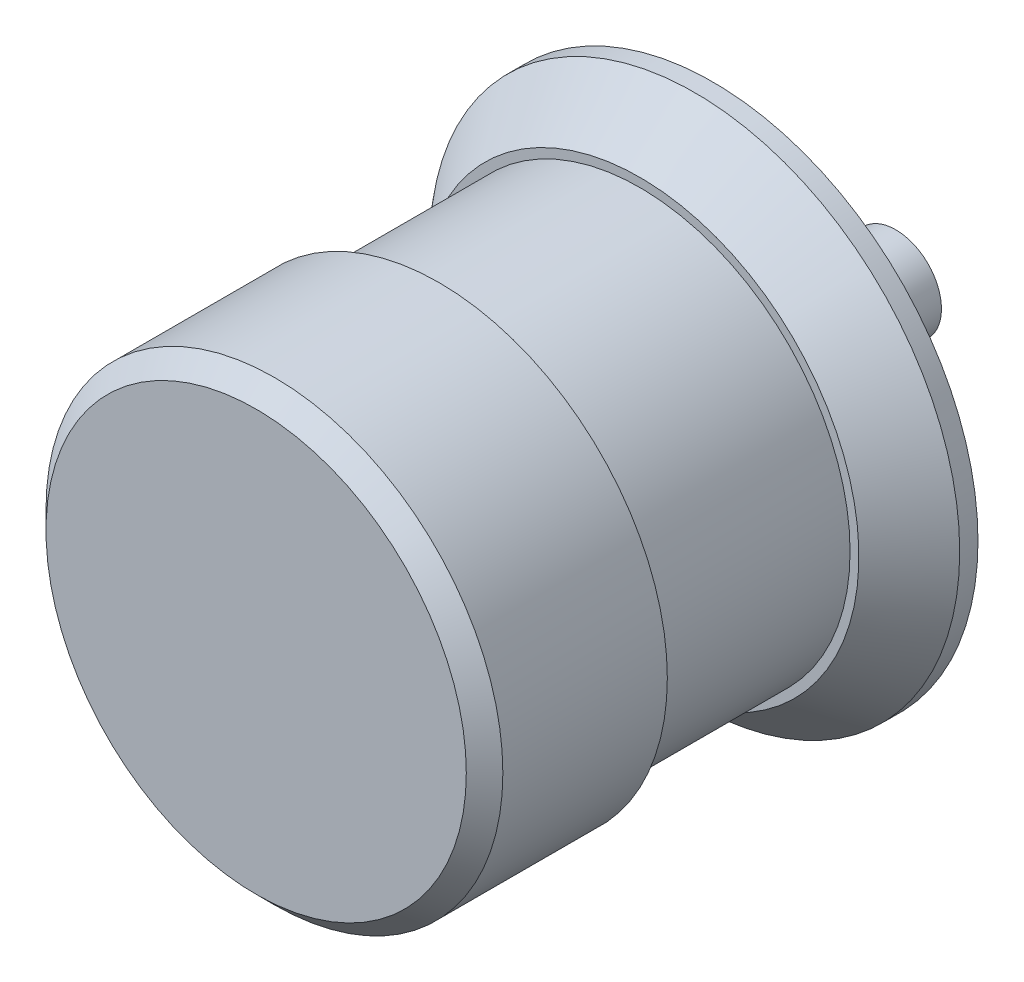
ISO-10303-21;
HEADER;
FILE_DESCRIPTION(('STEP AP214'),'2;1');
FILE_NAME('part.step','',(''),(''),'','','');
FILE_SCHEMA(('AUTOMOTIVE_DESIGN { 1 0 10303 214 1 1 1 1 }'));
ENDSEC;
DATA;
#1=APPLICATION_CONTEXT('core data for automotive mechanical design processes');
#2=APPLICATION_PROTOCOL_DEFINITION('international standard','automotive_design',2000,#1);
#3=PRODUCT_CONTEXT('',#1,'mechanical');
#4=PRODUCT('Part','Part','',(#3));
#5=PRODUCT_RELATED_PRODUCT_CATEGORY('part','',(#4));
#6=PRODUCT_DEFINITION_FORMATION('','',#4);
#7=PRODUCT_DEFINITION_CONTEXT('part definition',#1,'design');
#8=PRODUCT_DEFINITION('design','',#6,#7);
#9=PRODUCT_DEFINITION_SHAPE('','',#8);
#10=(LENGTH_UNIT() NAMED_UNIT(*) SI_UNIT(.MILLI.,.METRE.));
#11=(NAMED_UNIT(*) PLANE_ANGLE_UNIT() SI_UNIT($,.RADIAN.));
#12=(NAMED_UNIT(*) SI_UNIT($,.STERADIAN.) SOLID_ANGLE_UNIT());
#13=UNCERTAINTY_MEASURE_WITH_UNIT(LENGTH_MEASURE(1.E-05),#10,'distance_accuracy_value','');
#14=(GEOMETRIC_REPRESENTATION_CONTEXT(3) GLOBAL_UNCERTAINTY_ASSIGNED_CONTEXT((#13)) GLOBAL_UNIT_ASSIGNED_CONTEXT((#10,
#11,#12)) REPRESENTATION_CONTEXT('',''));
#15=CARTESIAN_POINT('',(0.,0.,0.));
#16=DIRECTION('',(0.,0.,1.));
#17=DIRECTION('',(1.,0.,0.));
#18=AXIS2_PLACEMENT_3D('',#15,#16,#17);
#19=CARTESIAN_POINT('',(0.,0.,30.));
#20=DIRECTION('',(0.,0.,-1.));
#21=DIRECTION('',(-1.,0.,0.));
#22=AXIS2_PLACEMENT_3D('',#19,#20,#21);
#23=CYLINDRICAL_SURFACE('',#22,29.);
#24=CARTESIAN_POINT('',(0.,0.,1.99999999999995));
#25=DIRECTION('',(0.,0.,1.));
#26=DIRECTION('',(1.,0.,0.));
#27=AXIS2_PLACEMENT_3D('',#24,#25,#26);
#28=CIRCLE('',#27,29.);
#29=CARTESIAN_POINT('',(-29.,0.,1.99999999999995));
#30=VERTEX_POINT('',#29);
#31=EDGE_CURVE('E54',#30,#30,#28,.F.);
#32=ORIENTED_EDGE('',*,*,#31,.T.);
#33=EDGE_LOOP('',(#32));
#34=FACE_BOUND('',#33,.T.);
#35=CARTESIAN_POINT('',(0.,0.,0.));
#36=DIRECTION('',(0.,0.,1.));
#37=DIRECTION('',(1.,0.,0.));
#38=AXIS2_PLACEMENT_3D('',#35,#36,#37);
#39=CIRCLE('',#38,29.);
#40=CARTESIAN_POINT('',(29.,0.,0.));
#41=VERTEX_POINT('',#40);
#42=EDGE_CURVE('E62',#41,#41,#39,.T.);
#43=ORIENTED_EDGE('',*,*,#42,.T.);
#44=EDGE_LOOP('',(#43));
#45=FACE_BOUND('',#44,.T.);
#46=ADVANCED_FACE('F39',(#34,#45),#23,.T.);
#47=CARTESIAN_POINT('',(0.,0.,0.));
#48=DIRECTION('',(0.,0.,1.));
#49=DIRECTION('',(1.,0.,0.));
#50=AXIS2_PLACEMENT_3D('',#47,#48,#49);
#51=PLANE('',#50);
#52=CARTESIAN_POINT('',(0.,0.,0.));
#53=DIRECTION('',(0.,0.,-1.));
#54=DIRECTION('',(-1.,0.,0.));
#55=AXIS2_PLACEMENT_3D('',#52,#53,#54);
#56=CIRCLE('',#55,5.);
#57=CARTESIAN_POINT('',(-5.,0.,0.));
#58=VERTEX_POINT('',#57);
#59=EDGE_CURVE('E50',#58,#58,#56,.T.);
#60=ORIENTED_EDGE('',*,*,#59,.F.);
#61=EDGE_LOOP('',(#60));
#62=FACE_BOUND('',#61,.T.);
#63=ORIENTED_EDGE('',*,*,#42,.F.);
#64=EDGE_LOOP('',(#63));
#65=FACE_BOUND('',#64,.T.);
#66=ADVANCED_FACE('F87',(#62,#65),#51,.F.);
#67=CARTESIAN_POINT('',(0.,0.,8.));
#68=DIRECTION('',(0.,0.,1.));
#69=DIRECTION('',(1.,0.,0.));
#70=AXIS2_PLACEMENT_3D('',#67,#68,#69);
#71=PLANE('',#70);
#72=CARTESIAN_POINT('',(0.,0.,8.));
#73=DIRECTION('',(0.,0.,1.));
#74=DIRECTION('',(1.,0.,0.));
#75=AXIS2_PLACEMENT_3D('',#72,#73,#74);
#76=CIRCLE('',#75,23.9654022129363);
#77=CARTESIAN_POINT('',(-23.9654022129363,0.,8.));
#78=VERTEX_POINT('',#77);
#79=EDGE_CURVE('E59',#78,#78,#76,.T.);
#80=ORIENTED_EDGE('',*,*,#79,.T.);
#81=EDGE_LOOP('',(#80));
#82=FACE_BOUND('',#81,.T.);
#83=CARTESIAN_POINT('',(0.,0.,8.));
#84=DIRECTION('',(0.,0.,1.));
#85=DIRECTION('',(1.,0.,0.));
#86=AXIS2_PLACEMENT_3D('',#83,#84,#85);
#87=CIRCLE('',#86,23.);
#88=CARTESIAN_POINT('',(23.,0.,8.));
#89=VERTEX_POINT('',#88);
#90=EDGE_CURVE('E65',#89,#89,#87,.T.);
#91=ORIENTED_EDGE('',*,*,#90,.F.);
#92=EDGE_LOOP('',(#91));
#93=FACE_BOUND('',#92,.T.);
#94=ADVANCED_FACE('F90',(#82,#93),#71,.T.);
#95=CARTESIAN_POINT('',(0.,0.,8.));
#96=DIRECTION('',(0.,0.,1.));
#97=DIRECTION('',(1.,0.,0.));
#98=AXIS2_PLACEMENT_3D('',#95,#96,#97);
#99=CYLINDRICAL_SURFACE('',#98,23.);
#100=ORIENTED_EDGE('',*,*,#90,.T.);
#101=EDGE_LOOP('',(#100));
#102=FACE_BOUND('',#101,.T.);
#103=CARTESIAN_POINT('',(0.,0.,30.));
#104=DIRECTION('',(0.,0.,1.));
#105=DIRECTION('',(1.,0.,0.));
#106=AXIS2_PLACEMENT_3D('',#103,#104,#105);
#107=CIRCLE('',#106,23.);
#108=CARTESIAN_POINT('',(23.,0.,30.));
#109=VERTEX_POINT('',#108);
#110=EDGE_CURVE('E66',#109,#109,#107,.T.);
#111=ORIENTED_EDGE('',*,*,#110,.F.);
#112=EDGE_LOOP('',(#111));
#113=FACE_BOUND('',#112,.T.);
#114=ADVANCED_FACE('F103',(#102,#113),#99,.T.);
#115=CARTESIAN_POINT('',(0.,0.,8.));
#116=DIRECTION('',(0.,0.,-1.));
#117=DIRECTION('',(-1.,0.,0.));
#118=AXIS2_PLACEMENT_3D('',#115,#116,#117);
#119=CONICAL_SURFACE('',#118,23.9654022129363,0.69813170079773);
#120=CARTESIAN_POINT('',(-29.,0.,1.99999999999995));
#121=CARTESIAN_POINT('',(-28.9475562730514,0.,2.06249999999995));
#122=CARTESIAN_POINT('',(-28.8951125461028,0.,2.12499999999995));
#123=CARTESIAN_POINT('',(-28.7902250922057,0.,2.24999999999995));
#124=CARTESIAN_POINT('',(-28.7377813652571,0.,2.31249999999995));
#125=CARTESIAN_POINT('',(-28.6328939113599,0.,2.43749999999996));
#126=CARTESIAN_POINT('',(-28.5804501844114,0.,2.49999999999996));
#127=CARTESIAN_POINT('',(-28.4755627305142,0.,2.62499999999996));
#128=CARTESIAN_POINT('',(-28.4231190035656,0.,2.68749999999996));
#129=CARTESIAN_POINT('',(-28.3182315496685,0.,2.81249999999996));
#130=CARTESIAN_POINT('',(-28.2657878227199,0.,2.87499999999996));
#131=CARTESIAN_POINT('',(-28.1609003688227,0.,2.99999999999996));
#132=CARTESIAN_POINT('',(-28.1084566418741,0.,3.06249999999996));
#133=CARTESIAN_POINT('',(-28.003569187977,0.,3.18749999999996));
#134=CARTESIAN_POINT('',(-27.9511254610284,0.,3.24999999999996));
#135=CARTESIAN_POINT('',(-27.8462380071312,0.,3.37499999999996));
#136=CARTESIAN_POINT('',(-27.7937942801827,0.,3.43749999999996));
#137=CARTESIAN_POINT('',(-27.6889068262855,0.,3.56249999999996));
#138=CARTESIAN_POINT('',(-27.6364630993369,0.,3.62499999999996));
#139=CARTESIAN_POINT('',(-27.5315756454398,0.,3.74999999999997));
#140=CARTESIAN_POINT('',(-27.4791319184912,0.,3.81249999999997));
#141=CARTESIAN_POINT('',(-27.374244464594,0.,3.93749999999997));
#142=CARTESIAN_POINT('',(-27.3218007376454,0.,3.99999999999997));
#143=CARTESIAN_POINT('',(-27.2169132837483,0.,4.12499999999997));
#144=CARTESIAN_POINT('',(-27.1644695567997,0.,4.18749999999997));
#145=CARTESIAN_POINT('',(-27.0595821029025,0.,4.31249999999997));
#146=CARTESIAN_POINT('',(-27.007138375954,0.,4.37499999999997));
#147=CARTESIAN_POINT('',(-26.9022509220568,0.,4.49999999999997));
#148=CARTESIAN_POINT('',(-26.8498071951082,0.,4.56249999999997));
#149=CARTESIAN_POINT('',(-26.7449197412111,0.,4.68749999999997));
#150=CARTESIAN_POINT('',(-26.6924760142625,0.,4.74999999999998));
#151=CARTESIAN_POINT('',(-26.5875885603653,0.,4.87499999999998));
#152=CARTESIAN_POINT('',(-26.5351448334167,0.,4.93749999999998));
#153=CARTESIAN_POINT('',(-26.4302573795196,0.,5.06249999999998));
#154=CARTESIAN_POINT('',(-26.377813652571,0.,5.12499999999998));
#155=CARTESIAN_POINT('',(-26.2729261986738,0.,5.24999999999998));
#156=CARTESIAN_POINT('',(-26.2204824717253,0.,5.31249999999998));
#157=CARTESIAN_POINT('',(-26.1155950178281,0.,5.43749999999998));
#158=CARTESIAN_POINT('',(-26.0631512908795,0.,5.49999999999998));
#159=CARTESIAN_POINT('',(-25.9582638369824,0.,5.62499999999998));
#160=CARTESIAN_POINT('',(-25.9058201100338,0.,5.68749999999998));
#161=CARTESIAN_POINT('',(-25.8009326561366,0.,5.81249999999998));
#162=CARTESIAN_POINT('',(-25.748488929188,0.,5.87499999999998));
#163=CARTESIAN_POINT('',(-25.6436014752909,0.,5.99999999999998));
#164=CARTESIAN_POINT('',(-25.5911577483423,0.,6.06249999999998));
#165=CARTESIAN_POINT('',(-25.4862702944451,0.,6.18749999999998));
#166=CARTESIAN_POINT('',(-25.4338265674965,0.,6.24999999999999));
#167=CARTESIAN_POINT('',(-25.3289391135994,0.,6.37499999999999));
#168=CARTESIAN_POINT('',(-25.2764953866508,0.,6.43749999999999));
#169=CARTESIAN_POINT('',(-25.1716079327536,0.,6.56249999999999));
#170=CARTESIAN_POINT('',(-25.1191642058051,0.,6.62499999999999));
#171=CARTESIAN_POINT('',(-25.0142767519079,0.,6.74999999999999));
#172=CARTESIAN_POINT('',(-24.9618330249593,0.,6.81249999999999));
#173=CARTESIAN_POINT('',(-24.8569455710622,0.,6.93749999999999));
#174=CARTESIAN_POINT('',(-24.8045018441136,0.,6.99999999999999));
#175=CARTESIAN_POINT('',(-24.6996143902164,0.,7.12499999999999));
#176=CARTESIAN_POINT('',(-24.6471706632678,0.,7.18749999999999));
#177=CARTESIAN_POINT('',(-24.5422832093707,0.,7.31249999999999));
#178=CARTESIAN_POINT('',(-24.4898394824221,0.,7.37499999999999));
#179=CARTESIAN_POINT('',(-24.3849520285249,0.,7.5));
#180=CARTESIAN_POINT('',(-24.3325083015764,0.,7.5625));
#181=CARTESIAN_POINT('',(-24.2276208476792,0.,7.6875));
#182=CARTESIAN_POINT('',(-24.1751771207306,0.,7.75));
#183=CARTESIAN_POINT('',(-24.0702896668335,0.,7.875));
#184=CARTESIAN_POINT('',(-24.0178459398849,0.,7.9375));
#185=CARTESIAN_POINT('',(-23.9654022129363,0.,8.));
#186=B_SPLINE_CURVE_WITH_KNOTS('',3,(#120,#121,#122,#123,#124,#125,#126,#127,#128,#129,#130,
#131,#132,#133,#134,#135,#136,#137,#138,#139,#140,#141,#142,#143,#144,#145,#146,#147,#148,#149,
#150,#151,#152,#153,#154,#155,#156,#157,#158,#159,#160,#161,#162,#163,#164,#165,#166,#167,#168,
#169,#170,#171,#172,#173,#174,#175,#176,#177,#178,#179,#180,#181,#182,#183,#184,#185),
.UNSPECIFIED.,.F.,.F.,(4,2,2,2,2,2,2,2,2,2,2,2,2,2,2,2,2,2,2,2,2,2,2,2,2,2,2,2,2,2,2,2,4),(0.,
0.244763866749805,0.489527733499608,0.734291600249413,0.979055466999217,1.22381933374902,
1.46858320049882,1.71334706724863,1.95811093399843,2.20287480074824,2.44763866749804,
2.69240253424784,2.93716640099765,3.18193026774745,3.42669413449725,3.67145800124706,
3.91622186799686,4.16098573474666,4.40574960149647,4.65051346824627,4.89527733499607,
5.14004120174588,5.38480506849568,5.62956893524549,5.87433280199529,6.11909666874509,
6.3638605354949,6.6086244022447,6.8533882689945,7.09815213574431,7.34291600249411,
7.58767986924391,7.83244373599372),.UNSPECIFIED.);
#187=EDGE_CURVE('BSEAM100',#30,#78,#186,.T.);
#188=ORIENTED_EDGE('',*,*,#31,.F.);
#189=ORIENTED_EDGE('',*,*,#79,.F.);
#190=ORIENTED_EDGE('',*,*,#187,.T.);
#191=ORIENTED_EDGE('',*,*,#187,.F.);
#192=EDGE_LOOP('',(#188,#190,#189,#191));
#193=FACE_BOUND('',#192,.T.);
#194=ADVANCED_FACE('F100',(#193),#119,.T.);
#195=CARTESIAN_POINT('',(0.,0.,50.));
#196=DIRECTION('',(0.,0.,-1.));
#197=DIRECTION('',(-1.,0.,0.));
#198=AXIS2_PLACEMENT_3D('',#195,#196,#197);
#199=CYLINDRICAL_SURFACE('',#198,25.);
#200=CARTESIAN_POINT('',(0.,0.,48.));
#201=DIRECTION('',(0.,0.,1.));
#202=DIRECTION('',(1.,0.,0.));
#203=AXIS2_PLACEMENT_3D('',#200,#201,#202);
#204=CIRCLE('',#203,25.);
#205=CARTESIAN_POINT('',(25.,0.,48.));
#206=VERTEX_POINT('',#205);
#207=EDGE_CURVE('E11',#206,#206,#204,.F.);
#208=ORIENTED_EDGE('',*,*,#207,.T.);
#209=EDGE_LOOP('',(#208));
#210=FACE_BOUND('',#209,.T.);
#211=CARTESIAN_POINT('',(0.,0.,30.));
#212=DIRECTION('',(0.,0.,1.));
#213=DIRECTION('',(1.,0.,0.));
#214=AXIS2_PLACEMENT_3D('',#211,#212,#213);
#215=CIRCLE('',#214,25.);
#216=CARTESIAN_POINT('',(25.,0.,30.));
#217=VERTEX_POINT('',#216);
#218=EDGE_CURVE('E69',#217,#217,#215,.T.);
#219=ORIENTED_EDGE('',*,*,#218,.T.);
#220=EDGE_LOOP('',(#219));
#221=FACE_BOUND('',#220,.T.);
#222=ADVANCED_FACE('F102',(#210,#221),#199,.T.);
#223=CARTESIAN_POINT('',(0.,0.,50.));
#224=DIRECTION('',(0.,0.,1.));
#225=DIRECTION('',(1.,0.,0.));
#226=AXIS2_PLACEMENT_3D('',#223,#224,#225);
#227=PLANE('',#226);
#228=CARTESIAN_POINT('',(0.,0.,50.));
#229=DIRECTION('',(0.,0.,1.));
#230=DIRECTION('',(1.,0.,0.));
#231=AXIS2_PLACEMENT_3D('',#228,#229,#230);
#232=CIRCLE('',#231,23.);
#233=CARTESIAN_POINT('',(23.,0.,50.));
#234=VERTEX_POINT('',#233);
#235=EDGE_CURVE('E46',#234,#234,#232,.T.);
#236=ORIENTED_EDGE('',*,*,#235,.T.);
#237=EDGE_LOOP('',(#236));
#238=FACE_BOUND('',#237,.T.);
#239=ADVANCED_FACE('F109',(#238),#227,.T.);
#240=CARTESIAN_POINT('',(0.,0.,30.));
#241=DIRECTION('',(0.,0.,1.));
#242=DIRECTION('',(1.,0.,0.));
#243=AXIS2_PLACEMENT_3D('',#240,#241,#242);
#244=PLANE('',#243);
#245=ORIENTED_EDGE('',*,*,#110,.T.);
#246=EDGE_LOOP('',(#245));
#247=FACE_BOUND('',#246,.T.);
#248=ORIENTED_EDGE('',*,*,#218,.F.);
#249=EDGE_LOOP('',(#248));
#250=FACE_BOUND('',#249,.T.);
#251=ADVANCED_FACE('F83',(#247,#250),#244,.F.);
#252=CARTESIAN_POINT('',(0.,0.,-20.));
#253=DIRECTION('',(0.,0.,1.));
#254=DIRECTION('',(1.,0.,0.));
#255=AXIS2_PLACEMENT_3D('',#252,#253,#254);
#256=CYLINDRICAL_SURFACE('',#255,5.);
#257=CARTESIAN_POINT('',(0.,0.,-20.));
#258=DIRECTION('',(0.,0.,-1.));
#259=DIRECTION('',(-1.,0.,0.));
#260=AXIS2_PLACEMENT_3D('',#257,#258,#259);
#261=CIRCLE('',#260,5.);
#262=CARTESIAN_POINT('',(-5.,0.,-20.));
#263=VERTEX_POINT('',#262);
#264=EDGE_CURVE('E73',#263,#263,#261,.T.);
#265=ORIENTED_EDGE('',*,*,#264,.F.);
#266=EDGE_LOOP('',(#265));
#267=FACE_BOUND('',#266,.T.);
#268=ORIENTED_EDGE('',*,*,#59,.T.);
#269=EDGE_LOOP('',(#268));
#270=FACE_BOUND('',#269,.T.);
#271=ADVANCED_FACE('F80',(#267,#270),#256,.T.);
#272=CARTESIAN_POINT('',(0.,0.,-20.));
#273=DIRECTION('',(0.,0.,-1.));
#274=DIRECTION('',(-1.,0.,0.));
#275=AXIS2_PLACEMENT_3D('',#272,#273,#274);
#276=PLANE('',#275);
#277=ORIENTED_EDGE('',*,*,#264,.T.);
#278=EDGE_LOOP('',(#277));
#279=FACE_BOUND('',#278,.T.);
#280=ADVANCED_FACE('F78',(#279),#276,.T.);
#281=CARTESIAN_POINT('',(0.,0.,50.));
#282=DIRECTION('',(0.,0.,-1.));
#283=DIRECTION('',(-1.,0.,0.));
#284=AXIS2_PLACEMENT_3D('',#281,#282,#283);
#285=CONICAL_SURFACE('',#284,23.,0.785398163397443);
#286=ORIENTED_EDGE('',*,*,#207,.F.);
#287=EDGE_LOOP('',(#286));
#288=FACE_BOUND('',#287,.T.);
#289=ORIENTED_EDGE('',*,*,#235,.F.);
#290=EDGE_LOOP('',(#289));
#291=FACE_BOUND('',#290,.T.);
#292=ADVANCED_FACE('F41',(#288,#291),#285,.T.);
#293=CLOSED_SHELL('',(#46,#66,#94,#114,#194,#222,#239,#251,#271,#280,#292));
#294=MANIFOLD_SOLID_BREP('B2',#293);
#295=ADVANCED_BREP_SHAPE_REPRESENTATION('',(#18,#294),#14);
#296=SHAPE_DEFINITION_REPRESENTATION(#9,#295);
ENDSEC;
END-ISO-10303-21;
